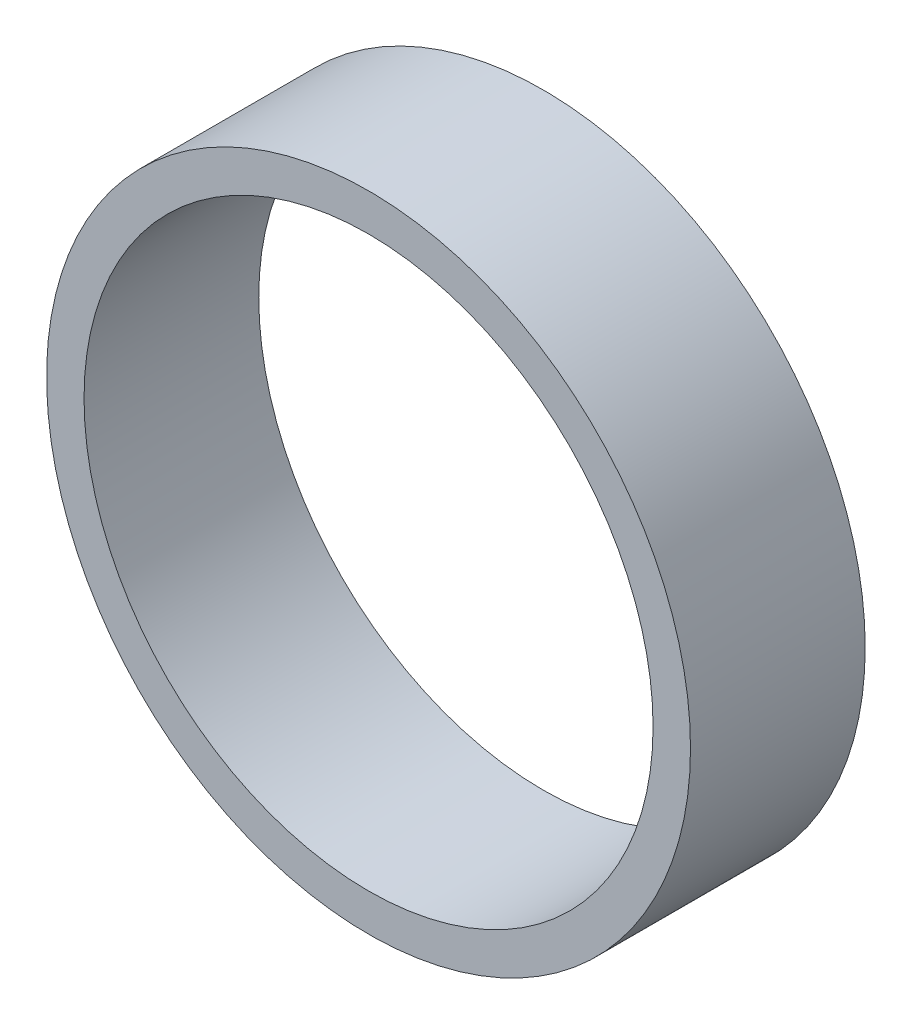
ISO-10303-21;
HEADER;
FILE_DESCRIPTION(('STEP AP214'),'2;1');
FILE_NAME('part.step','',(''),(''),'','','');
FILE_SCHEMA(('AUTOMOTIVE_DESIGN { 1 0 10303 214 1 1 1 1 }'));
ENDSEC;
DATA;
#1=APPLICATION_CONTEXT('core data for automotive mechanical design processes');
#2=APPLICATION_PROTOCOL_DEFINITION('international standard','automotive_design',2000,#1);
#3=PRODUCT_CONTEXT('',#1,'mechanical');
#4=PRODUCT('Part','Part','',(#3));
#5=PRODUCT_RELATED_PRODUCT_CATEGORY('part','',(#4));
#6=PRODUCT_DEFINITION_FORMATION('','',#4);
#7=PRODUCT_DEFINITION_CONTEXT('part definition',#1,'design');
#8=PRODUCT_DEFINITION('design','',#6,#7);
#9=PRODUCT_DEFINITION_SHAPE('','',#8);
#10=(LENGTH_UNIT() NAMED_UNIT(*) SI_UNIT(.MILLI.,.METRE.));
#11=(NAMED_UNIT(*) PLANE_ANGLE_UNIT() SI_UNIT($,.RADIAN.));
#12=(NAMED_UNIT(*) SI_UNIT($,.STERADIAN.) SOLID_ANGLE_UNIT());
#13=UNCERTAINTY_MEASURE_WITH_UNIT(LENGTH_MEASURE(1.E-05),#10,'distance_accuracy_value','');
#14=(GEOMETRIC_REPRESENTATION_CONTEXT(3) GLOBAL_UNCERTAINTY_ASSIGNED_CONTEXT((#13)) GLOBAL_UNIT_ASSIGNED_CONTEXT((#10,
#11,#12)) REPRESENTATION_CONTEXT('',''));
#15=CARTESIAN_POINT('',(0.,0.,0.));
#16=DIRECTION('',(0.,0.,1.));
#17=DIRECTION('',(1.,0.,0.));
#18=AXIS2_PLACEMENT_3D('',#15,#16,#17);
#19=CARTESIAN_POINT('',(0.,0.,3.5));
#20=DIRECTION('',(0.,0.,1.));
#21=DIRECTION('',(1.,0.,0.));
#22=AXIS2_PLACEMENT_3D('',#19,#20,#21);
#23=PLANE('',#22);
#24=CARTESIAN_POINT('',(0.,0.,3.5));
#25=DIRECTION('',(0.,0.,1.));
#26=DIRECTION('',(1.,0.,0.));
#27=AXIS2_PLACEMENT_3D('',#24,#25,#26);
#28=CIRCLE('',#27,6.45);
#29=CARTESIAN_POINT('',(6.45,0.,3.5));
#30=VERTEX_POINT('',#29);
#31=EDGE_CURVE('E10',#30,#30,#28,.T.);
#32=ORIENTED_EDGE('',*,*,#31,.T.);
#33=EDGE_LOOP('',(#32));
#34=FACE_BOUND('',#33,.T.);
#35=CARTESIAN_POINT('',(0.,0.,3.5));
#36=DIRECTION('',(0.,0.,1.));
#37=DIRECTION('',(1.,0.,0.));
#38=AXIS2_PLACEMENT_3D('',#35,#36,#37);
#39=CIRCLE('',#38,5.7);
#40=CARTESIAN_POINT('',(5.7,0.,3.5));
#41=VERTEX_POINT('',#40);
#42=EDGE_CURVE('E48',#41,#41,#39,.T.);
#43=ORIENTED_EDGE('',*,*,#42,.F.);
#44=EDGE_LOOP('',(#43));
#45=FACE_BOUND('',#44,.T.);
#46=ADVANCED_FACE('F40',(#34,#45),#23,.T.);
#47=CARTESIAN_POINT('',(0.,0.,0.));
#48=DIRECTION('',(0.,0.,1.));
#49=DIRECTION('',(1.,0.,0.));
#50=AXIS2_PLACEMENT_3D('',#47,#48,#49);
#51=PLANE('',#50);
#52=CARTESIAN_POINT('',(0.,0.,0.));
#53=DIRECTION('',(0.,0.,1.));
#54=DIRECTION('',(1.,0.,0.));
#55=AXIS2_PLACEMENT_3D('',#52,#53,#54);
#56=CIRCLE('',#55,6.45);
#57=CARTESIAN_POINT('',(6.45,0.,0.));
#58=VERTEX_POINT('',#57);
#59=EDGE_CURVE('E41',#58,#58,#56,.T.);
#60=ORIENTED_EDGE('',*,*,#59,.F.);
#61=EDGE_LOOP('',(#60));
#62=FACE_BOUND('',#61,.T.);
#63=CARTESIAN_POINT('',(0.,0.,0.));
#64=DIRECTION('',(0.,0.,1.));
#65=DIRECTION('',(1.,0.,0.));
#66=AXIS2_PLACEMENT_3D('',#63,#64,#65);
#67=CIRCLE('',#66,5.7);
#68=CARTESIAN_POINT('',(5.7,0.,0.));
#69=VERTEX_POINT('',#68);
#70=EDGE_CURVE('E49',#69,#69,#67,.T.);
#71=ORIENTED_EDGE('',*,*,#70,.T.);
#72=EDGE_LOOP('',(#71));
#73=FACE_BOUND('',#72,.T.);
#74=ADVANCED_FACE('F58',(#62,#73),#51,.F.);
#75=CARTESIAN_POINT('',(0.,0.,3.5));
#76=DIRECTION('',(0.,0.,-1.));
#77=DIRECTION('',(-1.,0.,0.));
#78=AXIS2_PLACEMENT_3D('',#75,#76,#77);
#79=CYLINDRICAL_SURFACE('',#78,6.45);
#80=ORIENTED_EDGE('',*,*,#31,.F.);
#81=EDGE_LOOP('',(#80));
#82=FACE_BOUND('',#81,.T.);
#83=ORIENTED_EDGE('',*,*,#59,.T.);
#84=EDGE_LOOP('',(#83));
#85=FACE_BOUND('',#84,.T.);
#86=ADVANCED_FACE('F39',(#82,#85),#79,.T.);
#87=CARTESIAN_POINT('',(0.,0.,3.5));
#88=DIRECTION('',(0.,0.,-1.));
#89=DIRECTION('',(-1.,0.,0.));
#90=AXIS2_PLACEMENT_3D('',#87,#88,#89);
#91=CYLINDRICAL_SURFACE('',#90,5.7);
#92=ORIENTED_EDGE('',*,*,#42,.T.);
#93=EDGE_LOOP('',(#92));
#94=FACE_BOUND('',#93,.T.);
#95=ORIENTED_EDGE('',*,*,#70,.F.);
#96=EDGE_LOOP('',(#95));
#97=FACE_BOUND('',#96,.T.);
#98=ADVANCED_FACE('F57',(#94,#97),#91,.F.);
#99=CLOSED_SHELL('',(#46,#74,#86,#98));
#100=MANIFOLD_SOLID_BREP('B2',#99);
#101=ADVANCED_BREP_SHAPE_REPRESENTATION('',(#18,#100),#14);
#102=SHAPE_DEFINITION_REPRESENTATION(#9,#101);
ENDSEC;
END-ISO-10303-21;
